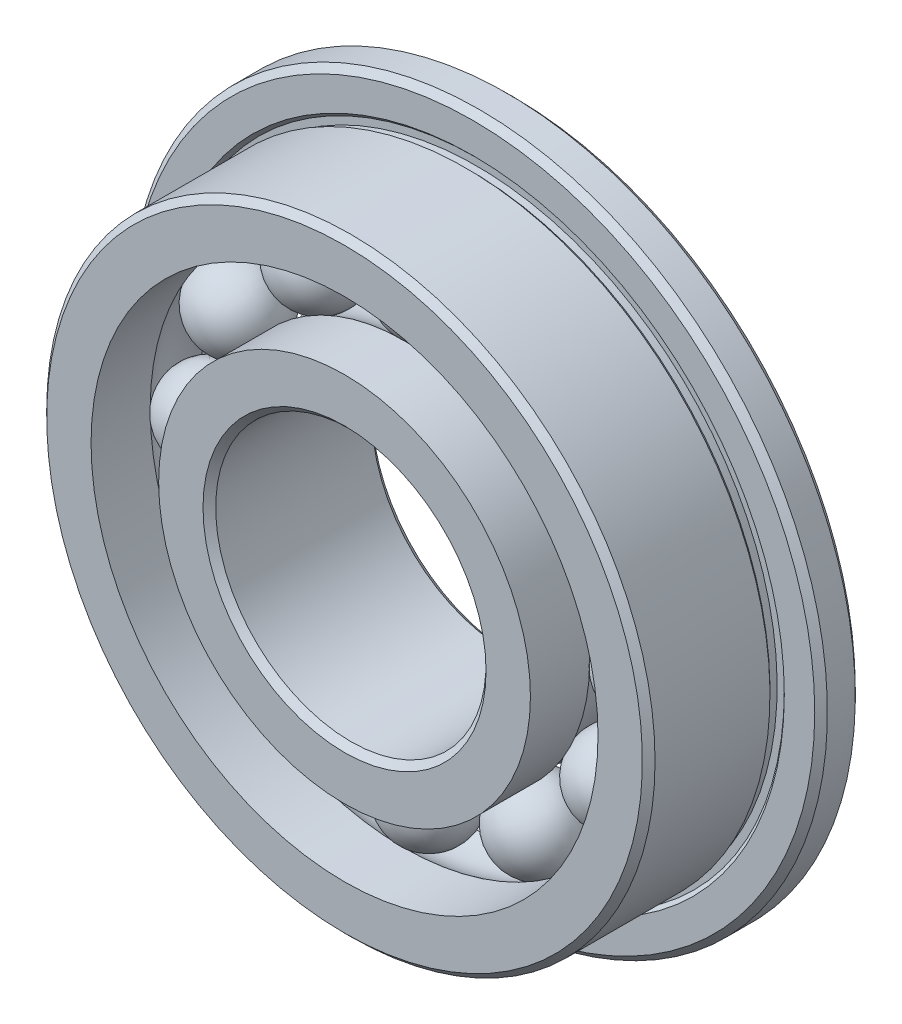
ISO-10303-21;
HEADER;
FILE_DESCRIPTION(('STEP AP214'),'2;1');
FILE_NAME('part.step','',(''),(''),'','','');
FILE_SCHEMA(('AUTOMOTIVE_DESIGN { 1 0 10303 214 1 1 1 1 }'));
ENDSEC;
DATA;
#1=APPLICATION_CONTEXT('core data for automotive mechanical design processes');
#2=APPLICATION_PROTOCOL_DEFINITION('international standard','automotive_design',2000,#1);
#3=PRODUCT_CONTEXT('',#1,'mechanical');
#4=PRODUCT('Part','Part','',(#3));
#5=PRODUCT_RELATED_PRODUCT_CATEGORY('part','',(#4));
#6=PRODUCT_DEFINITION_FORMATION('','',#4);
#7=PRODUCT_DEFINITION_CONTEXT('part definition',#1,'design');
#8=PRODUCT_DEFINITION('design','',#6,#7);
#9=PRODUCT_DEFINITION_SHAPE('','',#8);
#10=(LENGTH_UNIT() NAMED_UNIT(*) SI_UNIT(.MILLI.,.METRE.));
#11=(NAMED_UNIT(*) PLANE_ANGLE_UNIT() SI_UNIT($,.RADIAN.));
#12=(NAMED_UNIT(*) SI_UNIT($,.STERADIAN.) SOLID_ANGLE_UNIT());
#13=UNCERTAINTY_MEASURE_WITH_UNIT(LENGTH_MEASURE(1.E-05),#10,'distance_accuracy_value','');
#14=(GEOMETRIC_REPRESENTATION_CONTEXT(3) GLOBAL_UNCERTAINTY_ASSIGNED_CONTEXT((#13)) GLOBAL_UNIT_ASSIGNED_CONTEXT((#10,
#11,#12)) REPRESENTATION_CONTEXT('',''));
#15=CARTESIAN_POINT('',(0.,0.,0.));
#16=DIRECTION('',(0.,0.,1.));
#17=DIRECTION('',(1.,0.,0.));
#18=AXIS2_PLACEMENT_3D('',#15,#16,#17);
#19=CARTESIAN_POINT('',(-1.62499999999996,2.81458256229945,0.));
#20=DIRECTION('',(-0.499999999999989,0.866025403784445,0.));
#21=DIRECTION('',(0.866025403784445,0.499999999999989,0.));
#22=AXIS2_PLACEMENT_3D('',#19,#20,#21);
#23=SPHERICAL_SURFACE('',#22,0.625);
#24=CARTESIAN_POINT('',(-1.93749999999996,3.35584843966472,0.));
#25=VERTEX_POINT('',#24);
#26=VERTEX_LOOP('',#25);
#27=FACE_BOUND('',#26,.T.);
#28=ADVANCED_FACE('F44',(#27),#23,.T.);
#29=CLOSED_SHELL('',(#28));
#30=MANIFOLD_SOLID_BREP('B2',#29);
#31=CARTESIAN_POINT('',(-2.81458256229941,1.62500000000003,0.));
#32=DIRECTION('',(-0.866025403784433,0.50000000000001,0.));
#33=DIRECTION('',(0.50000000000001,0.866025403784433,0.));
#34=AXIS2_PLACEMENT_3D('',#31,#32,#33);
#35=SPHERICAL_SURFACE('',#34,0.625);
#36=CARTESIAN_POINT('',(-3.35584843966468,1.93750000000004,0.));
#37=VERTEX_POINT('',#36);
#38=VERTEX_LOOP('',#37);
#39=FACE_BOUND('',#38,.T.);
#40=ADVANCED_FACE('F63',(#39),#35,.T.);
#41=CLOSED_SHELL('',(#40));
#42=MANIFOLD_SOLID_BREP('B7',#41);
#43=CARTESIAN_POINT('',(-3.25,0.,0.));
#44=DIRECTION('',(-1.,0.,0.));
#45=DIRECTION('',(0.,1.,0.));
#46=AXIS2_PLACEMENT_3D('',#43,#44,#45);
#47=SPHERICAL_SURFACE('',#46,0.625);
#48=CARTESIAN_POINT('',(-3.875,0.,0.));
#49=VERTEX_POINT('',#48);
#50=VERTEX_LOOP('',#49);
#51=FACE_BOUND('',#50,.T.);
#52=ADVANCED_FACE('F82',(#51),#47,.T.);
#53=CLOSED_SHELL('',(#52));
#54=MANIFOLD_SOLID_BREP('B40',#53);
#55=CARTESIAN_POINT('',(-2.81458256229944,-1.62499999999997,0.));
#56=DIRECTION('',(-0.866025403784443,-0.499999999999992,0.));
#57=DIRECTION('',(-0.499999999999992,0.866025403784443,0.));
#58=AXIS2_PLACEMENT_3D('',#55,#56,#57);
#59=SPHERICAL_SURFACE('',#58,0.625);
#60=CARTESIAN_POINT('',(-3.35584843966472,-1.93749999999997,0.));
#61=VERTEX_POINT('',#60);
#62=VERTEX_LOOP('',#61);
#63=FACE_BOUND('',#62,.T.);
#64=ADVANCED_FACE('F101',(#63),#59,.T.);
#65=CLOSED_SHELL('',(#64));
#66=MANIFOLD_SOLID_BREP('B59',#65);
#67=CARTESIAN_POINT('',(-1.62500000000002,-2.81458256229941,0.));
#68=DIRECTION('',(-0.500000000000007,-0.866025403784435,0.));
#69=DIRECTION('',(-0.866025403784435,0.500000000000007,0.));
#70=AXIS2_PLACEMENT_3D('',#67,#68,#69);
#71=SPHERICAL_SURFACE('',#70,0.625);
#72=CARTESIAN_POINT('',(-1.93750000000003,-3.35584843966468,0.));
#73=VERTEX_POINT('',#72);
#74=VERTEX_LOOP('',#73);
#75=FACE_BOUND('',#74,.T.);
#76=ADVANCED_FACE('F120',(#75),#71,.T.);
#77=CLOSED_SHELL('',(#76));
#78=MANIFOLD_SOLID_BREP('B78',#77);
#79=CARTESIAN_POINT('',(0.,-3.25,0.));
#80=DIRECTION('',(0.,-1.,0.));
#81=DIRECTION('',(-1.,0.,0.));
#82=AXIS2_PLACEMENT_3D('',#79,#80,#81);
#83=SPHERICAL_SURFACE('',#82,0.625);
#84=CARTESIAN_POINT('',(0.,-3.875,0.));
#85=VERTEX_POINT('',#84);
#86=VERTEX_LOOP('',#85);
#87=FACE_BOUND('',#86,.T.);
#88=ADVANCED_FACE('F139',(#87),#83,.T.);
#89=CLOSED_SHELL('',(#88));
#90=MANIFOLD_SOLID_BREP('B97',#89);
#91=CARTESIAN_POINT('',(1.62499999999998,-2.81458256229944,0.));
#92=DIRECTION('',(0.499999999999995,-0.866025403784441,0.));
#93=DIRECTION('',(-0.866025403784441,-0.499999999999995,0.));
#94=AXIS2_PLACEMENT_3D('',#91,#92,#93);
#95=SPHERICAL_SURFACE('',#94,0.625);
#96=CARTESIAN_POINT('',(1.93749999999998,-3.35584843966471,0.));
#97=VERTEX_POINT('',#96);
#98=VERTEX_LOOP('',#97);
#99=FACE_BOUND('',#98,.T.);
#100=ADVANCED_FACE('F158',(#99),#95,.T.);
#101=CLOSED_SHELL('',(#100));
#102=MANIFOLD_SOLID_BREP('B116',#101);
#103=CARTESIAN_POINT('',(2.81458256229942,-1.62500000000001,0.));
#104=DIRECTION('',(0.866025403784437,-0.500000000000004,0.));
#105=DIRECTION('',(-0.500000000000004,-0.866025403784437,0.));
#106=AXIS2_PLACEMENT_3D('',#103,#104,#105);
#107=SPHERICAL_SURFACE('',#106,0.625);
#108=CARTESIAN_POINT('',(3.35584843966469,-1.93750000000002,0.));
#109=VERTEX_POINT('',#108);
#110=VERTEX_LOOP('',#109);
#111=FACE_BOUND('',#110,.T.);
#112=ADVANCED_FACE('F177',(#111),#107,.T.);
#113=CLOSED_SHELL('',(#112));
#114=MANIFOLD_SOLID_BREP('B135',#113);
#115=CARTESIAN_POINT('',(3.25,0.,0.));
#116=DIRECTION('',(1.,0.,0.));
#117=DIRECTION('',(0.,-1.,0.));
#118=AXIS2_PLACEMENT_3D('',#115,#116,#117);
#119=SPHERICAL_SURFACE('',#118,0.625);
#120=CARTESIAN_POINT('',(3.875,0.,0.));
#121=VERTEX_POINT('',#120);
#122=VERTEX_LOOP('',#121);
#123=FACE_BOUND('',#122,.T.);
#124=ADVANCED_FACE('F196',(#123),#119,.T.);
#125=CLOSED_SHELL('',(#124));
#126=MANIFOLD_SOLID_BREP('B154',#125);
#127=CARTESIAN_POINT('',(2.81458256229943,1.62499999999999,0.));
#128=DIRECTION('',(0.86602540378444,0.499999999999998,0.));
#129=DIRECTION('',(0.499999999999998,-0.86602540378444,0.));
#130=AXIS2_PLACEMENT_3D('',#127,#128,#129);
#131=SPHERICAL_SURFACE('',#130,0.625);
#132=CARTESIAN_POINT('',(3.3558484396647,1.93749999999999,0.));
#133=VERTEX_POINT('',#132);
#134=VERTEX_LOOP('',#133);
#135=FACE_BOUND('',#134,.T.);
#136=ADVANCED_FACE('F215',(#135),#131,.T.);
#137=CLOSED_SHELL('',(#136));
#138=MANIFOLD_SOLID_BREP('B173',#137);
#139=CARTESIAN_POINT('',(1.625,2.81458256229942,0.));
#140=DIRECTION('',(0.500000000000001,0.866025403784438,0.));
#141=DIRECTION('',(0.866025403784438,-0.500000000000001,0.));
#142=AXIS2_PLACEMENT_3D('',#139,#140,#141);
#143=SPHERICAL_SURFACE('',#142,0.625);
#144=CARTESIAN_POINT('',(1.9375,3.3558484396647,0.));
#145=VERTEX_POINT('',#144);
#146=VERTEX_LOOP('',#145);
#147=FACE_BOUND('',#146,.T.);
#148=ADVANCED_FACE('F234',(#147),#143,.T.);
#149=CLOSED_SHELL('',(#148));
#150=MANIFOLD_SOLID_BREP('B192',#149);
#151=CARTESIAN_POINT('',(0.,3.25,0.));
#152=DIRECTION('',(0.,1.,0.));
#153=DIRECTION('',(1.,0.,0.));
#154=AXIS2_PLACEMENT_3D('',#151,#152,#153);
#155=SPHERICAL_SURFACE('',#154,0.625);
#156=CARTESIAN_POINT('',(0.,3.875,0.));
#157=VERTEX_POINT('',#156);
#158=VERTEX_LOOP('',#157);
#159=FACE_BOUND('',#158,.T.);
#160=ADVANCED_FACE('F256',(#159),#155,.T.);
#161=CLOSED_SHELL('',(#160));
#162=MANIFOLD_SOLID_BREP('B211',#161);
#163=CARTESIAN_POINT('',(0.,0.,0.));
#164=DIRECTION('',(0.,0.,1.));
#165=DIRECTION('',(0.,-1.,0.));
#166=AXIS2_PLACEMENT_3D('',#163,#164,#165);
#167=CYLINDRICAL_SURFACE('',#166,2.75);
#168=CARTESIAN_POINT('',(0.,0.,-0.374999999999999));
#169=DIRECTION('',(0.,0.,1.));
#170=DIRECTION('',(0.,-1.,0.));
#171=AXIS2_PLACEMENT_3D('',#168,#169,#170);
#172=CIRCLE('',#171,2.75);
#173=CARTESIAN_POINT('',(0.,-2.75,-0.374999999999999));
#174=VERTEX_POINT('',#173);
#175=EDGE_CURVE('E298',#174,#174,#172,.T.);
#176=ORIENTED_EDGE('',*,*,#175,.F.);
#177=EDGE_LOOP('',(#176));
#178=FACE_BOUND('',#177,.T.);
#179=CARTESIAN_POINT('',(0.,0.,-1.25));
#180=DIRECTION('',(0.,0.,1.));
#181=DIRECTION('',(0.,-1.,0.));
#182=AXIS2_PLACEMENT_3D('',#179,#180,#181);
#183=CIRCLE('',#182,2.75);
#184=CARTESIAN_POINT('',(0.,-2.75,-1.25));
#185=VERTEX_POINT('',#184);
#186=EDGE_CURVE('E307',#185,#185,#183,.T.);
#187=ORIENTED_EDGE('',*,*,#186,.T.);
#188=EDGE_LOOP('',(#187));
#189=FACE_BOUND('',#188,.T.);
#190=ADVANCED_FACE('F278',(#178,#189),#167,.T.);
#191=CARTESIAN_POINT('',(0.,0.,0.));
#192=DIRECTION('',(0.,0.,1.));
#193=DIRECTION('',(0.,-1.,0.));
#194=AXIS2_PLACEMENT_3D('',#191,#192,#193);
#195=TOROIDAL_SURFACE('',#194,3.25,0.625);
#196=CARTESIAN_POINT('',(0.,0.,0.375));
#197=DIRECTION('',(0.,0.,1.));
#198=DIRECTION('',(0.,-1.,0.));
#199=AXIS2_PLACEMENT_3D('',#196,#197,#198);
#200=CIRCLE('',#199,2.75);
#201=CARTESIAN_POINT('',(0.,-2.75,0.375000000000001));
#202=VERTEX_POINT('',#201);
#203=EDGE_CURVE('E301',#202,#202,#200,.T.);
#204=ORIENTED_EDGE('',*,*,#203,.F.);
#205=EDGE_LOOP('',(#204));
#206=FACE_BOUND('',#205,.T.);
#207=ORIENTED_EDGE('',*,*,#175,.T.);
#208=EDGE_LOOP('',(#207));
#209=FACE_BOUND('',#208,.T.);
#210=ADVANCED_FACE('F326',(#206,#209),#195,.F.);
#211=CARTESIAN_POINT('',(0.,0.,0.));
#212=DIRECTION('',(0.,0.,1.));
#213=DIRECTION('',(0.,-1.,0.));
#214=AXIS2_PLACEMENT_3D('',#211,#212,#213);
#215=CYLINDRICAL_SURFACE('',#214,2.75);
#216=CARTESIAN_POINT('',(0.,0.,1.25));
#217=DIRECTION('',(0.,0.,1.));
#218=DIRECTION('',(0.,-1.,0.));
#219=AXIS2_PLACEMENT_3D('',#216,#217,#218);
#220=CIRCLE('',#219,2.75);
#221=CARTESIAN_POINT('',(0.,-2.75,1.25));
#222=VERTEX_POINT('',#221);
#223=EDGE_CURVE('E304',#222,#222,#220,.T.);
#224=ORIENTED_EDGE('',*,*,#223,.F.);
#225=EDGE_LOOP('',(#224));
#226=FACE_BOUND('',#225,.T.);
#227=ORIENTED_EDGE('',*,*,#203,.T.);
#228=EDGE_LOOP('',(#227));
#229=FACE_BOUND('',#228,.T.);
#230=ADVANCED_FACE('F332',(#226,#229),#215,.T.);
#231=CARTESIAN_POINT('',(0.,2.,1.25));
#232=DIRECTION('',(0.,0.,-1.));
#233=DIRECTION('',(0.,1.,0.));
#234=AXIS2_PLACEMENT_3D('',#231,#232,#233);
#235=PLANE('',#234);
#236=CARTESIAN_POINT('',(0.,0.,1.25));
#237=DIRECTION('',(0.,0.,-1.));
#238=DIRECTION('',(0.,1.,0.));
#239=AXIS2_PLACEMENT_3D('',#236,#237,#238);
#240=CIRCLE('',#239,2.09375);
#241=CARTESIAN_POINT('',(0.,2.09375,1.25));
#242=VERTEX_POINT('',#241);
#243=EDGE_CURVE('E255',#242,#242,#240,.T.);
#244=ORIENTED_EDGE('',*,*,#243,.T.);
#245=EDGE_LOOP('',(#244));
#246=FACE_BOUND('',#245,.T.);
#247=ORIENTED_EDGE('',*,*,#223,.T.);
#248=EDGE_LOOP('',(#247));
#249=FACE_BOUND('',#248,.T.);
#250=ADVANCED_FACE('F323',(#246,#249),#235,.F.);
#251=CARTESIAN_POINT('',(0.,0.,0.));
#252=DIRECTION('',(0.,0.,1.));
#253=DIRECTION('',(0.,-1.,0.));
#254=AXIS2_PLACEMENT_3D('',#251,#252,#253);
#255=CYLINDRICAL_SURFACE('',#254,2.);
#256=CARTESIAN_POINT('',(0.,0.,-1.15625));
#257=DIRECTION('',(0.,0.,1.));
#258=DIRECTION('',(0.,-1.,0.));
#259=AXIS2_PLACEMENT_3D('',#256,#257,#258);
#260=CIRCLE('',#259,2.);
#261=CARTESIAN_POINT('',(0.,-2.,-1.15625));
#262=VERTEX_POINT('',#261);
#263=EDGE_CURVE('E285',#262,#262,#260,.F.);
#264=ORIENTED_EDGE('',*,*,#263,.T.);
#265=EDGE_LOOP('',(#264));
#266=FACE_BOUND('',#265,.T.);
#267=CARTESIAN_POINT('',(0.,0.,1.15625));
#268=DIRECTION('',(0.,0.,-1.));
#269=DIRECTION('',(0.,1.,0.));
#270=AXIS2_PLACEMENT_3D('',#267,#268,#269);
#271=CIRCLE('',#270,2.);
#272=CARTESIAN_POINT('',(0.,2.,1.15625));
#273=VERTEX_POINT('',#272);
#274=EDGE_CURVE('E289',#273,#273,#271,.F.);
#275=ORIENTED_EDGE('',*,*,#274,.T.);
#276=EDGE_LOOP('',(#275));
#277=FACE_BOUND('',#276,.T.);
#278=ADVANCED_FACE('F315',(#266,#277),#255,.F.);
#279=CARTESIAN_POINT('',(0.,2.75,-1.25));
#280=DIRECTION('',(0.,0.,1.));
#281=DIRECTION('',(0.,-1.,0.));
#282=AXIS2_PLACEMENT_3D('',#279,#280,#281);
#283=PLANE('',#282);
#284=CARTESIAN_POINT('',(0.,0.,-1.25));
#285=DIRECTION('',(0.,0.,1.));
#286=DIRECTION('',(0.,-1.,0.));
#287=AXIS2_PLACEMENT_3D('',#284,#285,#286);
#288=CIRCLE('',#287,2.09375);
#289=CARTESIAN_POINT('',(0.,-2.09375,-1.25));
#290=VERTEX_POINT('',#289);
#291=EDGE_CURVE('E293',#290,#290,#288,.T.);
#292=ORIENTED_EDGE('',*,*,#291,.T.);
#293=EDGE_LOOP('',(#292));
#294=FACE_BOUND('',#293,.T.);
#295=ORIENTED_EDGE('',*,*,#186,.F.);
#296=EDGE_LOOP('',(#295));
#297=FACE_BOUND('',#296,.T.);
#298=ADVANCED_FACE('F312',(#294,#297),#283,.F.);
#299=CARTESIAN_POINT('',(0.,0.,-1.25));
#300=DIRECTION('',(0.,0.,-1.));
#301=DIRECTION('',(0.,1.,0.));
#302=AXIS2_PLACEMENT_3D('',#299,#300,#301);
#303=CONICAL_SURFACE('',#302,2.09375,0.785398163397448);
#304=ORIENTED_EDGE('',*,*,#263,.F.);
#305=EDGE_LOOP('',(#304));
#306=FACE_BOUND('',#305,.T.);
#307=ORIENTED_EDGE('',*,*,#291,.F.);
#308=EDGE_LOOP('',(#307));
#309=FACE_BOUND('',#308,.T.);
#310=ADVANCED_FACE('F314',(#306,#309),#303,.F.);
#311=CARTESIAN_POINT('',(0.,0.,1.15625));
#312=DIRECTION('',(0.,0.,1.));
#313=DIRECTION('',(0.,-1.,0.));
#314=AXIS2_PLACEMENT_3D('',#311,#312,#313);
#315=CONICAL_SURFACE('',#314,2.,0.785398163397448);
#316=ORIENTED_EDGE('',*,*,#243,.F.);
#317=EDGE_LOOP('',(#316));
#318=FACE_BOUND('',#317,.T.);
#319=ORIENTED_EDGE('',*,*,#274,.F.);
#320=EDGE_LOOP('',(#319));
#321=FACE_BOUND('',#320,.T.);
#322=ADVANCED_FACE('F280',(#318,#321),#315,.F.);
#323=CLOSED_SHELL('',(#190,#210,#230,#250,#278,#298,#310,#322));
#324=MANIFOLD_SOLID_BREP('B230',#323);
#325=CARTESIAN_POINT('',(0.,3.75,-1.25));
#326=DIRECTION('',(0.,0.,1.));
#327=DIRECTION('',(0.,-1.,0.));
#328=AXIS2_PLACEMENT_3D('',#325,#326,#327);
#329=PLANE('',#328);
#330=CARTESIAN_POINT('',(0.,0.,-1.25));
#331=DIRECTION('',(0.,0.,1.));
#332=DIRECTION('',(0.,-1.,0.));
#333=AXIS2_PLACEMENT_3D('',#330,#331,#332);
#334=CIRCLE('',#333,5.05625);
#335=CARTESIAN_POINT('',(0.,-5.05625,-1.25));
#336=VERTEX_POINT('',#335);
#337=EDGE_CURVE('E416',#336,#336,#334,.F.);
#338=ORIENTED_EDGE('',*,*,#337,.T.);
#339=EDGE_LOOP('',(#338));
#340=FACE_BOUND('',#339,.T.);
#341=CARTESIAN_POINT('',(0.,0.,-1.25));
#342=DIRECTION('',(0.,0.,1.));
#343=DIRECTION('',(0.,-1.,0.));
#344=AXIS2_PLACEMENT_3D('',#341,#342,#343);
#345=CIRCLE('',#344,3.75);
#346=CARTESIAN_POINT('',(0.,-3.75,-1.25));
#347=VERTEX_POINT('',#346);
#348=EDGE_CURVE('E427',#347,#347,#345,.T.);
#349=ORIENTED_EDGE('',*,*,#348,.T.);
#350=EDGE_LOOP('',(#349));
#351=FACE_BOUND('',#350,.T.);
#352=ADVANCED_FACE('F401',(#340,#351),#329,.F.);
#353=CARTESIAN_POINT('',(0.,0.,0.));
#354=DIRECTION('',(0.,0.,1.));
#355=DIRECTION('',(0.,-1.,0.));
#356=AXIS2_PLACEMENT_3D('',#353,#354,#355);
#357=CYLINDRICAL_SURFACE('',#356,3.75);
#358=ORIENTED_EDGE('',*,*,#348,.F.);
#359=EDGE_LOOP('',(#358));
#360=FACE_BOUND('',#359,.T.);
#361=CARTESIAN_POINT('',(0.,0.,-0.375));
#362=DIRECTION('',(0.,0.,1.));
#363=DIRECTION('',(0.,-1.,0.));
#364=AXIS2_PLACEMENT_3D('',#361,#362,#363);
#365=CIRCLE('',#364,3.75);
#366=CARTESIAN_POINT('',(0.,-3.75,-0.374999999999999));
#367=VERTEX_POINT('',#366);
#368=EDGE_CURVE('E430',#367,#367,#365,.T.);
#369=ORIENTED_EDGE('',*,*,#368,.T.);
#370=EDGE_LOOP('',(#369));
#371=FACE_BOUND('',#370,.T.);
#372=ADVANCED_FACE('F473',(#360,#371),#357,.F.);
#373=CARTESIAN_POINT('',(0.,0.,0.));
#374=DIRECTION('',(0.,0.,1.));
#375=DIRECTION('',(0.,-1.,0.));
#376=AXIS2_PLACEMENT_3D('',#373,#374,#375);
#377=TOROIDAL_SURFACE('',#376,3.25,0.625);
#378=ORIENTED_EDGE('',*,*,#368,.F.);
#379=EDGE_LOOP('',(#378));
#380=FACE_BOUND('',#379,.T.);
#381=CARTESIAN_POINT('',(0.,0.,0.375));
#382=DIRECTION('',(0.,0.,1.));
#383=DIRECTION('',(0.,-1.,0.));
#384=AXIS2_PLACEMENT_3D('',#381,#382,#383);
#385=CIRCLE('',#384,3.75);
#386=CARTESIAN_POINT('',(0.,-3.75,0.375000000000001));
#387=VERTEX_POINT('',#386);
#388=EDGE_CURVE('E433',#387,#387,#385,.T.);
#389=ORIENTED_EDGE('',*,*,#388,.T.);
#390=EDGE_LOOP('',(#389));
#391=FACE_BOUND('',#390,.T.);
#392=ADVANCED_FACE('F479',(#380,#391),#377,.F.);
#393=CARTESIAN_POINT('',(0.,0.,0.));
#394=DIRECTION('',(0.,0.,1.));
#395=DIRECTION('',(0.,-1.,0.));
#396=AXIS2_PLACEMENT_3D('',#393,#394,#395);
#397=CYLINDRICAL_SURFACE('',#396,3.75);
#398=ORIENTED_EDGE('',*,*,#388,.F.);
#399=EDGE_LOOP('',(#398));
#400=FACE_BOUND('',#399,.T.);
#401=CARTESIAN_POINT('',(0.,0.,1.25));
#402=DIRECTION('',(0.,0.,1.));
#403=DIRECTION('',(0.,-1.,0.));
#404=AXIS2_PLACEMENT_3D('',#401,#402,#403);
#405=CIRCLE('',#404,3.75);
#406=CARTESIAN_POINT('',(0.,-3.75,1.25));
#407=VERTEX_POINT('',#406);
#408=EDGE_CURVE('E436',#407,#407,#405,.T.);
#409=ORIENTED_EDGE('',*,*,#408,.T.);
#410=EDGE_LOOP('',(#409));
#411=FACE_BOUND('',#410,.T.);
#412=ADVANCED_FACE('F543',(#400,#411),#397,.F.);
#413=CARTESIAN_POINT('',(0.,4.5,1.25));
#414=DIRECTION('',(0.,0.,-1.));
#415=DIRECTION('',(0.,1.,0.));
#416=AXIS2_PLACEMENT_3D('',#413,#414,#415);
#417=PLANE('',#416);
#418=CARTESIAN_POINT('',(0.,0.,1.25));
#419=DIRECTION('',(0.,0.,-1.));
#420=DIRECTION('',(0.,1.,0.));
#421=AXIS2_PLACEMENT_3D('',#418,#419,#420);
#422=CIRCLE('',#421,4.40625);
#423=CARTESIAN_POINT('',(0.,4.40625,1.25));
#424=VERTEX_POINT('',#423);
#425=EDGE_CURVE('E408',#424,#424,#422,.F.);
#426=ORIENTED_EDGE('',*,*,#425,.T.);
#427=EDGE_LOOP('',(#426));
#428=FACE_BOUND('',#427,.T.);
#429=ORIENTED_EDGE('',*,*,#408,.F.);
#430=EDGE_LOOP('',(#429));
#431=FACE_BOUND('',#430,.T.);
#432=ADVANCED_FACE('F533',(#428,#431),#417,.F.);
#433=CARTESIAN_POINT('',(0.,0.,0.));
#434=DIRECTION('',(0.,0.,1.));
#435=DIRECTION('',(0.,-1.,0.));
#436=AXIS2_PLACEMENT_3D('',#433,#434,#435);
#437=CYLINDRICAL_SURFACE('',#436,4.5);
#438=CARTESIAN_POINT('',(0.,0.,1.15625));
#439=DIRECTION('',(0.,0.,-1.));
#440=DIRECTION('',(0.,1.,0.));
#441=AXIS2_PLACEMENT_3D('',#438,#439,#440);
#442=CIRCLE('',#441,4.5);
#443=CARTESIAN_POINT('',(0.,4.5,1.15625));
#444=VERTEX_POINT('',#443);
#445=EDGE_CURVE('E277',#444,#444,#442,.T.);
#446=ORIENTED_EDGE('',*,*,#445,.T.);
#447=EDGE_LOOP('',(#446));
#448=FACE_BOUND('',#447,.T.);
#449=CARTESIAN_POINT('',(0.,0.,-0.543933982822017));
#450=DIRECTION('',(0.,0.,1.));
#451=DIRECTION('',(0.,-1.,0.));
#452=AXIS2_PLACEMENT_3D('',#449,#450,#451);
#453=CIRCLE('',#452,4.5);
#454=CARTESIAN_POINT('',(0.,-4.5,-0.543933982822016));
#455=VERTEX_POINT('',#454);
#456=EDGE_CURVE('E439',#455,#455,#453,.T.);
#457=ORIENTED_EDGE('',*,*,#456,.T.);
#458=EDGE_LOOP('',(#457));
#459=FACE_BOUND('',#458,.T.);
#460=ADVANCED_FACE('F527',(#448,#459),#437,.T.);
#461=CARTESIAN_POINT('',(0.,0.,-0.59696699141101));
#462=DIRECTION('',(0.,0.,1.));
#463=DIRECTION('',(0.,-1.,0.));
#464=AXIS2_PLACEMENT_3D('',#461,#462,#463);
#465=CONICAL_SURFACE('',#464,4.44696699141101,0.785398163397434);
#466=ORIENTED_EDGE('',*,*,#456,.F.);
#467=EDGE_LOOP('',(#466));
#468=FACE_BOUND('',#467,.T.);
#469=CARTESIAN_POINT('',(0.,0.,-0.59696699141101));
#470=DIRECTION('',(0.,0.,1.));
#471=DIRECTION('',(0.,-1.,0.));
#472=AXIS2_PLACEMENT_3D('',#469,#470,#471);
#473=CIRCLE('',#472,4.44696699141101);
#474=CARTESIAN_POINT('',(0.,-4.44696699141101,-0.596966991411009));
#475=VERTEX_POINT('',#474);
#476=EDGE_CURVE('E442',#475,#475,#473,.T.);
#477=ORIENTED_EDGE('',*,*,#476,.T.);
#478=EDGE_LOOP('',(#477));
#479=FACE_BOUND('',#478,.T.);
#480=ADVANCED_FACE('F532',(#468,#479),#465,.T.);
#481=CARTESIAN_POINT('',(0.,0.,0.));
#482=DIRECTION('',(0.,0.,1.));
#483=DIRECTION('',(0.,-1.,0.));
#484=AXIS2_PLACEMENT_3D('',#481,#482,#483);
#485=CYLINDRICAL_SURFACE('',#484,4.44696699141101);
#486=ORIENTED_EDGE('',*,*,#476,.F.);
#487=EDGE_LOOP('',(#486));
#488=FACE_BOUND('',#487,.T.);
#489=CARTESIAN_POINT('',(0.,0.,-0.703033008588992));
#490=DIRECTION('',(0.,0.,1.));
#491=DIRECTION('',(0.,-1.,0.));
#492=AXIS2_PLACEMENT_3D('',#489,#490,#491);
#493=CIRCLE('',#492,4.44696699141101);
#494=CARTESIAN_POINT('',(0.,-4.44696699141101,-0.703033008588992));
#495=VERTEX_POINT('',#494);
#496=EDGE_CURVE('E445',#495,#495,#493,.T.);
#497=ORIENTED_EDGE('',*,*,#496,.T.);
#498=EDGE_LOOP('',(#497));
#499=FACE_BOUND('',#498,.T.);
#500=ADVANCED_FACE('F565',(#488,#499),#485,.T.);
#501=CARTESIAN_POINT('',(0.,4.55303300858899,-0.703033008588993));
#502=DIRECTION('',(0.,0.,-1.));
#503=DIRECTION('',(0.,1.,0.));
#504=AXIS2_PLACEMENT_3D('',#501,#502,#503);
#505=PLANE('',#504);
#506=ORIENTED_EDGE('',*,*,#496,.F.);
#507=EDGE_LOOP('',(#506));
#508=FACE_BOUND('',#507,.T.);
#509=CARTESIAN_POINT('',(0.,0.,-0.703033008588992));
#510=DIRECTION('',(0.,0.,1.));
#511=DIRECTION('',(0.,-1.,0.));
#512=AXIS2_PLACEMENT_3D('',#509,#510,#511);
#513=CIRCLE('',#512,4.55303300858899);
#514=CARTESIAN_POINT('',(0.,-4.55303300858899,-0.703033008588991));
#515=VERTEX_POINT('',#514);
#516=EDGE_CURVE('E448',#515,#515,#513,.T.);
#517=ORIENTED_EDGE('',*,*,#516,.T.);
#518=EDGE_LOOP('',(#517));
#519=FACE_BOUND('',#518,.T.);
#520=ADVANCED_FACE('F469',(#508,#519),#505,.F.);
#521=CARTESIAN_POINT('',(0.,0.,-0.65));
#522=DIRECTION('',(0.,0.,1.));
#523=DIRECTION('',(0.,-1.,0.));
#524=AXIS2_PLACEMENT_3D('',#521,#522,#523);
#525=CONICAL_SURFACE('',#524,4.60606601717798,0.785398163397434);
#526=ORIENTED_EDGE('',*,*,#516,.F.);
#527=EDGE_LOOP('',(#526));
#528=FACE_BOUND('',#527,.T.);
#529=CARTESIAN_POINT('',(0.,0.,-0.65));
#530=DIRECTION('',(0.,0.,1.));
#531=DIRECTION('',(0.,-1.,0.));
#532=AXIS2_PLACEMENT_3D('',#529,#530,#531);
#533=CIRCLE('',#532,4.60606601717798);
#534=CARTESIAN_POINT('',(0.,-4.60606601717798,-0.65));
#535=VERTEX_POINT('',#534);
#536=EDGE_CURVE('E451',#535,#535,#533,.T.);
#537=ORIENTED_EDGE('',*,*,#536,.T.);
#538=EDGE_LOOP('',(#537));
#539=FACE_BOUND('',#538,.T.);
#540=ADVANCED_FACE('F455',(#528,#539),#525,.F.);
#541=CARTESIAN_POINT('',(0.,5.15,-0.650000000000001));
#542=DIRECTION('',(0.,0.,-1.));
#543=DIRECTION('',(0.,1.,0.));
#544=AXIS2_PLACEMENT_3D('',#541,#542,#543);
#545=PLANE('',#544);
#546=CARTESIAN_POINT('',(0.,0.,-0.65));
#547=DIRECTION('',(0.,0.,-1.));
#548=DIRECTION('',(0.,1.,0.));
#549=AXIS2_PLACEMENT_3D('',#546,#547,#548);
#550=CIRCLE('',#549,5.05625);
#551=CARTESIAN_POINT('',(0.,5.05625,-0.650000000000001));
#552=VERTEX_POINT('',#551);
#553=EDGE_CURVE('E412',#552,#552,#550,.F.);
#554=ORIENTED_EDGE('',*,*,#553,.T.);
#555=EDGE_LOOP('',(#554));
#556=FACE_BOUND('',#555,.T.);
#557=ORIENTED_EDGE('',*,*,#536,.F.);
#558=EDGE_LOOP('',(#557));
#559=FACE_BOUND('',#558,.T.);
#560=ADVANCED_FACE('F457',(#556,#559),#545,.F.);
#561=CARTESIAN_POINT('',(0.,0.,0.));
#562=DIRECTION('',(0.,0.,1.));
#563=DIRECTION('',(0.,-1.,0.));
#564=AXIS2_PLACEMENT_3D('',#561,#562,#563);
#565=CYLINDRICAL_SURFACE('',#564,5.15);
#566=CARTESIAN_POINT('',(0.,0.,-1.15625));
#567=DIRECTION('',(0.,0.,1.));
#568=DIRECTION('',(0.,-1.,0.));
#569=AXIS2_PLACEMENT_3D('',#566,#567,#568);
#570=CIRCLE('',#569,5.15);
#571=CARTESIAN_POINT('',(0.,-5.15,-1.15625));
#572=VERTEX_POINT('',#571);
#573=EDGE_CURVE('E421',#572,#572,#570,.T.);
#574=ORIENTED_EDGE('',*,*,#573,.T.);
#575=EDGE_LOOP('',(#574));
#576=FACE_BOUND('',#575,.T.);
#577=CARTESIAN_POINT('',(0.,0.,-0.74375));
#578=DIRECTION('',(0.,0.,-1.));
#579=DIRECTION('',(0.,1.,0.));
#580=AXIS2_PLACEMENT_3D('',#577,#578,#579);
#581=CIRCLE('',#580,5.15);
#582=CARTESIAN_POINT('',(0.,5.15,-0.743750000000001));
#583=VERTEX_POINT('',#582);
#584=EDGE_CURVE('E424',#583,#583,#581,.T.);
#585=ORIENTED_EDGE('',*,*,#584,.T.);
#586=EDGE_LOOP('',(#585));
#587=FACE_BOUND('',#586,.T.);
#588=ADVANCED_FACE('F459',(#576,#587),#565,.T.);
#589=CARTESIAN_POINT('',(0.,0.,-1.15625));
#590=DIRECTION('',(0.,0.,1.));
#591=DIRECTION('',(0.,-1.,0.));
#592=AXIS2_PLACEMENT_3D('',#589,#590,#591);
#593=CONICAL_SURFACE('',#592,5.15,0.785398163397448);
#594=ORIENTED_EDGE('',*,*,#337,.F.);
#595=EDGE_LOOP('',(#594));
#596=FACE_BOUND('',#595,.T.);
#597=ORIENTED_EDGE('',*,*,#573,.F.);
#598=EDGE_LOOP('',(#597));
#599=FACE_BOUND('',#598,.T.);
#600=ADVANCED_FACE('F466',(#596,#599),#593,.T.);
#601=CARTESIAN_POINT('',(0.,0.,-0.65));
#602=DIRECTION('',(0.,0.,-1.));
#603=DIRECTION('',(0.,1.,0.));
#604=AXIS2_PLACEMENT_3D('',#601,#602,#603);
#605=CONICAL_SURFACE('',#604,5.05625,0.785398163397449);
#606=ORIENTED_EDGE('',*,*,#584,.F.);
#607=EDGE_LOOP('',(#606));
#608=FACE_BOUND('',#607,.T.);
#609=ORIENTED_EDGE('',*,*,#553,.F.);
#610=EDGE_LOOP('',(#609));
#611=FACE_BOUND('',#610,.T.);
#612=ADVANCED_FACE('F486',(#608,#611),#605,.T.);
#613=CARTESIAN_POINT('',(0.,0.,1.25));
#614=DIRECTION('',(0.,0.,-1.));
#615=DIRECTION('',(0.,1.,0.));
#616=AXIS2_PLACEMENT_3D('',#613,#614,#615);
#617=CONICAL_SURFACE('',#616,4.40625,0.785398163397448);
#618=ORIENTED_EDGE('',*,*,#445,.F.);
#619=EDGE_LOOP('',(#618));
#620=FACE_BOUND('',#619,.T.);
#621=ORIENTED_EDGE('',*,*,#425,.F.);
#622=EDGE_LOOP('',(#621));
#623=FACE_BOUND('',#622,.T.);
#624=ADVANCED_FACE('F403',(#620,#623),#617,.T.);
#625=CLOSED_SHELL('',(#352,#372,#392,#412,#432,#460,#480,#500,#520,#540,#560,#588,#600,#612,#624));
#626=MANIFOLD_SOLID_BREP('B250',#625);
#627=ADVANCED_BREP_SHAPE_REPRESENTATION('',(#18,#30,#42,#54,#66,#78,#90,#102,#114,#126,#138,
#150,#162,#324,#626),#14);
#628=SHAPE_DEFINITION_REPRESENTATION(#9,#627);
ENDSEC;
END-ISO-10303-21;
